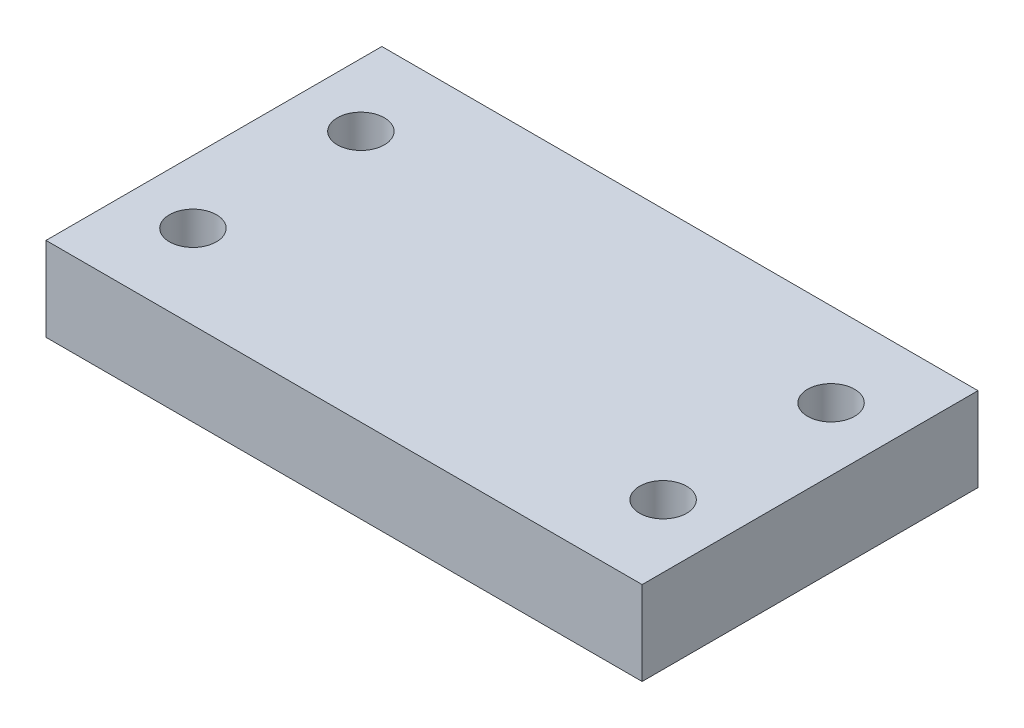
ISO-10303-21;
HEADER;
FILE_DESCRIPTION(('STEP AP214'),'2;1');
FILE_NAME('part.step','',(''),(''),'','','');
FILE_SCHEMA(('AUTOMOTIVE_DESIGN { 1 0 10303 214 1 1 1 1 }'));
ENDSEC;
DATA;
#1=APPLICATION_CONTEXT('core data for automotive mechanical design processes');
#2=APPLICATION_PROTOCOL_DEFINITION('international standard','automotive_design',2000,#1);
#3=PRODUCT_CONTEXT('',#1,'mechanical');
#4=PRODUCT('Part','Part','',(#3));
#5=PRODUCT_RELATED_PRODUCT_CATEGORY('part','',(#4));
#6=PRODUCT_DEFINITION_FORMATION('','',#4);
#7=PRODUCT_DEFINITION_CONTEXT('part definition',#1,'design');
#8=PRODUCT_DEFINITION('design','',#6,#7);
#9=PRODUCT_DEFINITION_SHAPE('','',#8);
#10=(LENGTH_UNIT() NAMED_UNIT(*) SI_UNIT(.MILLI.,.METRE.));
#11=(NAMED_UNIT(*) PLANE_ANGLE_UNIT() SI_UNIT($,.RADIAN.));
#12=(NAMED_UNIT(*) SI_UNIT($,.STERADIAN.) SOLID_ANGLE_UNIT());
#13=UNCERTAINTY_MEASURE_WITH_UNIT(LENGTH_MEASURE(1.E-05),#10,'distance_accuracy_value','');
#14=(GEOMETRIC_REPRESENTATION_CONTEXT(3) GLOBAL_UNCERTAINTY_ASSIGNED_CONTEXT((#13)) GLOBAL_UNIT_ASSIGNED_CONTEXT((#10,
#11,#12)) REPRESENTATION_CONTEXT('',''));
#15=CARTESIAN_POINT('',(0.,0.,0.));
#16=DIRECTION('',(0.,0.,1.));
#17=DIRECTION('',(1.,0.,0.));
#18=AXIS2_PLACEMENT_3D('',#15,#16,#17);
#19=CARTESIAN_POINT('',(0.,10.,0.));
#20=DIRECTION('',(0.,1.,0.));
#21=DIRECTION('',(0.,0.,1.));
#22=AXIS2_PLACEMENT_3D('',#19,#20,#21);
#23=PLANE('',#22);
#24=CARTESIAN_POINT('',(27.9999999999999,10.,-20.));
#25=DIRECTION('',(0.,1.,0.));
#26=DIRECTION('',(0.,0.,1.));
#27=AXIS2_PLACEMENT_3D('',#24,#25,#26);
#28=CIRCLE('',#27,2.8);
#29=CARTESIAN_POINT('',(27.9999999999999,10.,-17.2));
#30=VERTEX_POINT('',#29);
#31=EDGE_CURVE('E160',#30,#30,#28,.T.);
#32=ORIENTED_EDGE('',*,*,#31,.F.);
#33=EDGE_LOOP('',(#32));
#34=FACE_BOUND('',#33,.T.);
#35=CARTESIAN_POINT('',(28.,10.,0.));
#36=DIRECTION('',(0.,1.,0.));
#37=DIRECTION('',(0.,0.,1.));
#38=AXIS2_PLACEMENT_3D('',#35,#36,#37);
#39=CIRCLE('',#38,2.8);
#40=CARTESIAN_POINT('',(28.,10.,2.8));
#41=VERTEX_POINT('',#40);
#42=EDGE_CURVE('E103',#41,#41,#39,.T.);
#43=ORIENTED_EDGE('',*,*,#42,.F.);
#44=EDGE_LOOP('',(#43));
#45=FACE_BOUND('',#44,.T.);
#46=DIRECTION('',(0.,0.,-1.));
#47=VECTOR('',#46,1.);
#48=CARTESIAN_POINT('',(35.5,10.,-30.));
#49=LINE('',#48,#47);
#50=CARTESIAN_POINT('',(35.5,10.,10.));
#51=VERTEX_POINT('',#50);
#52=CARTESIAN_POINT('',(35.5,10.,-30.));
#53=VERTEX_POINT('',#52);
#54=EDGE_CURVE('E54',#51,#53,#49,.T.);
#55=ORIENTED_EDGE('',*,*,#54,.T.);
#56=DIRECTION('',(-1.,0.,0.));
#57=VECTOR('',#56,1.);
#58=CARTESIAN_POINT('',(-35.5,10.,-30.));
#59=LINE('',#58,#57);
#60=CARTESIAN_POINT('',(-35.5,10.,-30.));
#61=VERTEX_POINT('',#60);
#62=EDGE_CURVE('E84',#53,#61,#59,.T.);
#63=ORIENTED_EDGE('',*,*,#62,.T.);
#64=DIRECTION('',(0.,0.,1.));
#65=VECTOR('',#64,1.);
#66=CARTESIAN_POINT('',(-35.5,10.,-10.));
#67=LINE('',#66,#65);
#68=CARTESIAN_POINT('',(-35.5,10.,10.));
#69=VERTEX_POINT('',#68);
#70=EDGE_CURVE('E88',#61,#69,#67,.T.);
#71=ORIENTED_EDGE('',*,*,#70,.T.);
#72=DIRECTION('',(1.,0.,0.));
#73=VECTOR('',#72,1.);
#74=CARTESIAN_POINT('',(-35.5,10.,10.));
#75=LINE('',#74,#73);
#76=EDGE_CURVE('E96',#69,#51,#75,.T.);
#77=ORIENTED_EDGE('',*,*,#76,.T.);
#78=EDGE_LOOP('',(#55,#63,#71,#77));
#79=FACE_BOUND('',#78,.T.);
#80=CARTESIAN_POINT('',(-28.,10.,0.));
#81=DIRECTION('',(0.,1.,0.));
#82=DIRECTION('',(0.,0.,-1.));
#83=AXIS2_PLACEMENT_3D('',#80,#81,#82);
#84=CIRCLE('',#83,2.8);
#85=CARTESIAN_POINT('',(-28.,10.,-2.8));
#86=VERTEX_POINT('',#85);
#87=EDGE_CURVE('E166',#86,#86,#84,.T.);
#88=ORIENTED_EDGE('',*,*,#87,.F.);
#89=EDGE_LOOP('',(#88));
#90=FACE_BOUND('',#89,.T.);
#91=CARTESIAN_POINT('',(-28.0000000000001,10.,-20.));
#92=DIRECTION('',(0.,1.,0.));
#93=DIRECTION('',(0.,0.,-1.));
#94=AXIS2_PLACEMENT_3D('',#91,#92,#93);
#95=CIRCLE('',#94,2.8);
#96=CARTESIAN_POINT('',(-28.0000000000001,10.,-22.8));
#97=VERTEX_POINT('',#96);
#98=EDGE_CURVE('E151',#97,#97,#95,.T.);
#99=ORIENTED_EDGE('',*,*,#98,.F.);
#100=EDGE_LOOP('',(#99));
#101=FACE_BOUND('',#100,.T.);
#102=ADVANCED_FACE('F37',(#34,#45,#79,#90,#101),#23,.T.);
#103=CARTESIAN_POINT('',(0.,0.,0.));
#104=DIRECTION('',(0.,1.,0.));
#105=DIRECTION('',(0.,0.,1.));
#106=AXIS2_PLACEMENT_3D('',#103,#104,#105);
#107=PLANE('',#106);
#108=DIRECTION('',(-1.,0.,0.));
#109=VECTOR('',#108,1.);
#110=CARTESIAN_POINT('',(-35.5,0.,-30.));
#111=LINE('',#110,#109);
#112=CARTESIAN_POINT('',(35.5,0.,-30.));
#113=VERTEX_POINT('',#112);
#114=CARTESIAN_POINT('',(-35.5,0.,-30.));
#115=VERTEX_POINT('',#114);
#116=EDGE_CURVE('E92',#113,#115,#111,.T.);
#117=ORIENTED_EDGE('',*,*,#116,.F.);
#118=DIRECTION('',(0.,0.,-1.));
#119=VECTOR('',#118,1.);
#120=CARTESIAN_POINT('',(35.5,0.,10.));
#121=LINE('',#120,#119);
#122=CARTESIAN_POINT('',(35.5,0.,10.));
#123=VERTEX_POINT('',#122);
#124=EDGE_CURVE('E106',#123,#113,#121,.T.);
#125=ORIENTED_EDGE('',*,*,#124,.F.);
#126=DIRECTION('',(1.,0.,0.));
#127=VECTOR('',#126,1.);
#128=CARTESIAN_POINT('',(-35.5,0.,10.));
#129=LINE('',#128,#127);
#130=CARTESIAN_POINT('',(-35.5,0.,10.));
#131=VERTEX_POINT('',#130);
#132=EDGE_CURVE('E78',#131,#123,#129,.T.);
#133=ORIENTED_EDGE('',*,*,#132,.F.);
#134=DIRECTION('',(0.,0.,1.));
#135=VECTOR('',#134,1.);
#136=CARTESIAN_POINT('',(-35.5,0.,10.));
#137=LINE('',#136,#135);
#138=EDGE_CURVE('E71',#115,#131,#137,.T.);
#139=ORIENTED_EDGE('',*,*,#138,.F.);
#140=EDGE_LOOP('',(#117,#125,#133,#139));
#141=FACE_BOUND('',#140,.T.);
#142=CARTESIAN_POINT('',(28.,0.,0.));
#143=DIRECTION('',(0.,1.,0.));
#144=DIRECTION('',(0.,0.,1.));
#145=AXIS2_PLACEMENT_3D('',#142,#143,#144);
#146=CIRCLE('',#145,2.8);
#147=CARTESIAN_POINT('',(28.,0.,2.8));
#148=VERTEX_POINT('',#147);
#149=EDGE_CURVE('E169',#148,#148,#146,.T.);
#150=ORIENTED_EDGE('',*,*,#149,.T.);
#151=EDGE_LOOP('',(#150));
#152=FACE_BOUND('',#151,.T.);
#153=CARTESIAN_POINT('',(-28.,0.,0.));
#154=DIRECTION('',(0.,1.,0.));
#155=DIRECTION('',(0.,0.,-1.));
#156=AXIS2_PLACEMENT_3D('',#153,#154,#155);
#157=CIRCLE('',#156,2.8);
#158=CARTESIAN_POINT('',(-28.,0.,-2.8));
#159=VERTEX_POINT('',#158);
#160=EDGE_CURVE('E163',#159,#159,#157,.T.);
#161=ORIENTED_EDGE('',*,*,#160,.T.);
#162=EDGE_LOOP('',(#161));
#163=FACE_BOUND('',#162,.T.);
#164=CARTESIAN_POINT('',(27.9999999999999,0.,-20.));
#165=DIRECTION('',(0.,1.,0.));
#166=DIRECTION('',(0.,0.,1.));
#167=AXIS2_PLACEMENT_3D('',#164,#165,#166);
#168=CIRCLE('',#167,2.8);
#169=CARTESIAN_POINT('',(27.9999999999999,0.,-17.2));
#170=VERTEX_POINT('',#169);
#171=EDGE_CURVE('E157',#170,#170,#168,.T.);
#172=ORIENTED_EDGE('',*,*,#171,.T.);
#173=EDGE_LOOP('',(#172));
#174=FACE_BOUND('',#173,.T.);
#175=CARTESIAN_POINT('',(-28.0000000000001,0.,-20.));
#176=DIRECTION('',(0.,1.,0.));
#177=DIRECTION('',(0.,0.,-1.));
#178=AXIS2_PLACEMENT_3D('',#175,#176,#177);
#179=CIRCLE('',#178,2.8);
#180=CARTESIAN_POINT('',(-28.0000000000001,0.,-22.8));
#181=VERTEX_POINT('',#180);
#182=EDGE_CURVE('E154',#181,#181,#179,.T.);
#183=ORIENTED_EDGE('',*,*,#182,.T.);
#184=EDGE_LOOP('',(#183));
#185=FACE_BOUND('',#184,.T.);
#186=ADVANCED_FACE('F112',(#141,#152,#163,#174,#185),#107,.F.);
#187=CARTESIAN_POINT('',(-35.5,10.,-30.));
#188=DIRECTION('',(0.,0.,1.));
#189=DIRECTION('',(1.,0.,0.));
#190=AXIS2_PLACEMENT_3D('',#187,#188,#189);
#191=PLANE('',#190);
#192=ORIENTED_EDGE('',*,*,#116,.T.);
#193=DIRECTION('',(0.,-1.,0.));
#194=VECTOR('',#193,1.);
#195=CARTESIAN_POINT('',(-35.5,10.,-30.));
#196=LINE('',#195,#194);
#197=EDGE_CURVE('E46',#61,#115,#196,.T.);
#198=ORIENTED_EDGE('',*,*,#197,.F.);
#199=ORIENTED_EDGE('',*,*,#62,.F.);
#200=DIRECTION('',(0.,-1.,0.));
#201=VECTOR('',#200,1.);
#202=CARTESIAN_POINT('',(35.5,10.,-30.));
#203=LINE('',#202,#201);
#204=EDGE_CURVE('E11',#53,#113,#203,.T.);
#205=ORIENTED_EDGE('',*,*,#204,.T.);
#206=EDGE_LOOP('',(#192,#198,#199,#205));
#207=FACE_BOUND('',#206,.T.);
#208=ADVANCED_FACE('F39',(#207),#191,.F.);
#209=CARTESIAN_POINT('',(-35.5,10.,10.));
#210=DIRECTION('',(1.,0.,0.));
#211=DIRECTION('',(0.,0.,-1.));
#212=AXIS2_PLACEMENT_3D('',#209,#210,#211);
#213=PLANE('',#212);
#214=ORIENTED_EDGE('',*,*,#138,.T.);
#215=DIRECTION('',(0.,-1.,0.));
#216=VECTOR('',#215,1.);
#217=CARTESIAN_POINT('',(-35.5,10.,10.));
#218=LINE('',#217,#216);
#219=EDGE_CURVE('E93',#69,#131,#218,.T.);
#220=ORIENTED_EDGE('',*,*,#219,.F.);
#221=ORIENTED_EDGE('',*,*,#70,.F.);
#222=ORIENTED_EDGE('',*,*,#197,.T.);
#223=EDGE_LOOP('',(#214,#220,#221,#222));
#224=FACE_BOUND('',#223,.T.);
#225=ADVANCED_FACE('F94',(#224),#213,.F.);
#226=CARTESIAN_POINT('',(-35.5,10.,10.));
#227=DIRECTION('',(0.,0.,-1.));
#228=DIRECTION('',(-1.,0.,0.));
#229=AXIS2_PLACEMENT_3D('',#226,#227,#228);
#230=PLANE('',#229);
#231=ORIENTED_EDGE('',*,*,#132,.T.);
#232=DIRECTION('',(0.,-1.,0.));
#233=VECTOR('',#232,1.);
#234=CARTESIAN_POINT('',(35.5,10.,10.));
#235=LINE('',#234,#233);
#236=EDGE_CURVE('E98',#51,#123,#235,.T.);
#237=ORIENTED_EDGE('',*,*,#236,.F.);
#238=ORIENTED_EDGE('',*,*,#76,.F.);
#239=ORIENTED_EDGE('',*,*,#219,.T.);
#240=EDGE_LOOP('',(#231,#237,#238,#239));
#241=FACE_BOUND('',#240,.T.);
#242=ADVANCED_FACE('F109',(#241),#230,.F.);
#243=CARTESIAN_POINT('',(35.5,10.,10.));
#244=DIRECTION('',(-1.,0.,0.));
#245=DIRECTION('',(0.,0.,1.));
#246=AXIS2_PLACEMENT_3D('',#243,#244,#245);
#247=PLANE('',#246);
#248=ORIENTED_EDGE('',*,*,#124,.T.);
#249=ORIENTED_EDGE('',*,*,#204,.F.);
#250=ORIENTED_EDGE('',*,*,#54,.F.);
#251=ORIENTED_EDGE('',*,*,#236,.T.);
#252=EDGE_LOOP('',(#248,#249,#250,#251));
#253=FACE_BOUND('',#252,.T.);
#254=ADVANCED_FACE('F114',(#253),#247,.F.);
#255=CARTESIAN_POINT('',(28.,10.,0.));
#256=DIRECTION('',(0.,-1.,0.));
#257=DIRECTION('',(0.,0.,-1.));
#258=AXIS2_PLACEMENT_3D('',#255,#256,#257);
#259=CYLINDRICAL_SURFACE('',#258,2.8);
#260=ORIENTED_EDGE('',*,*,#42,.T.);
#261=EDGE_LOOP('',(#260));
#262=FACE_BOUND('',#261,.T.);
#263=ORIENTED_EDGE('',*,*,#149,.F.);
#264=EDGE_LOOP('',(#263));
#265=FACE_BOUND('',#264,.T.);
#266=ADVANCED_FACE('F116',(#262,#265),#259,.F.);
#267=CARTESIAN_POINT('',(-28.,10.,0.));
#268=DIRECTION('',(0.,-1.,0.));
#269=DIRECTION('',(0.,0.,-1.));
#270=AXIS2_PLACEMENT_3D('',#267,#268,#269);
#271=CYLINDRICAL_SURFACE('',#270,2.8);
#272=ORIENTED_EDGE('',*,*,#87,.T.);
#273=EDGE_LOOP('',(#272));
#274=FACE_BOUND('',#273,.T.);
#275=ORIENTED_EDGE('',*,*,#160,.F.);
#276=EDGE_LOOP('',(#275));
#277=FACE_BOUND('',#276,.T.);
#278=ADVANCED_FACE('F122',(#274,#277),#271,.F.);
#279=CARTESIAN_POINT('',(27.9999999999999,10.,-20.));
#280=DIRECTION('',(0.,-1.,0.));
#281=DIRECTION('',(0.,0.,-1.));
#282=AXIS2_PLACEMENT_3D('',#279,#280,#281);
#283=CYLINDRICAL_SURFACE('',#282,2.8);
#284=ORIENTED_EDGE('',*,*,#31,.T.);
#285=EDGE_LOOP('',(#284));
#286=FACE_BOUND('',#285,.T.);
#287=ORIENTED_EDGE('',*,*,#171,.F.);
#288=EDGE_LOOP('',(#287));
#289=FACE_BOUND('',#288,.T.);
#290=ADVANCED_FACE('F138',(#286,#289),#283,.F.);
#291=CARTESIAN_POINT('',(-28.0000000000001,10.,-20.));
#292=DIRECTION('',(0.,-1.,0.));
#293=DIRECTION('',(0.,0.,-1.));
#294=AXIS2_PLACEMENT_3D('',#291,#292,#293);
#295=CYLINDRICAL_SURFACE('',#294,2.8);
#296=ORIENTED_EDGE('',*,*,#98,.T.);
#297=EDGE_LOOP('',(#296));
#298=FACE_BOUND('',#297,.T.);
#299=ORIENTED_EDGE('',*,*,#182,.F.);
#300=EDGE_LOOP('',(#299));
#301=FACE_BOUND('',#300,.T.);
#302=ADVANCED_FACE('F142',(#298,#301),#295,.F.);
#303=CLOSED_SHELL('',(#102,#186,#208,#225,#242,#254,#266,#278,#290,#302));
#304=MANIFOLD_SOLID_BREP('B2',#303);
#305=ADVANCED_BREP_SHAPE_REPRESENTATION('',(#18,#304),#14);
#306=SHAPE_DEFINITION_REPRESENTATION(#9,#305);
ENDSEC;
END-ISO-10303-21;
